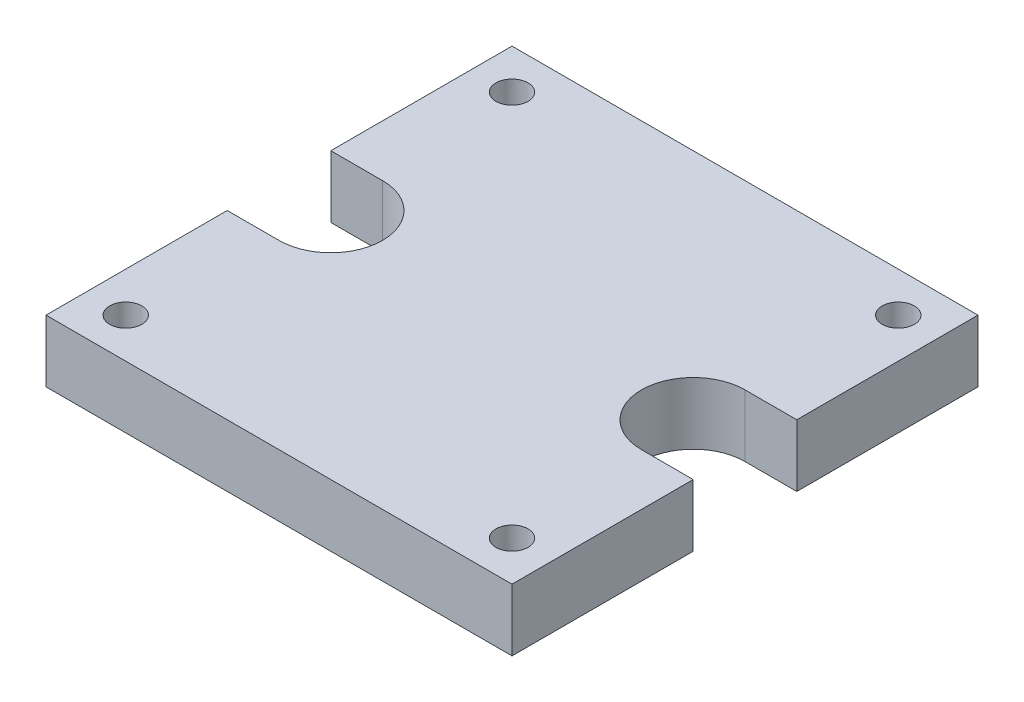
ISO-10303-21;
HEADER;
FILE_DESCRIPTION(('STEP AP214'),'2;1');
FILE_NAME('part.step','',(''),(''),'','','');
FILE_SCHEMA(('AUTOMOTIVE_DESIGN { 1 0 10303 214 1 1 1 1 }'));
ENDSEC;
DATA;
#1=APPLICATION_CONTEXT('core data for automotive mechanical design processes');
#2=APPLICATION_PROTOCOL_DEFINITION('international standard','automotive_design',2000,#1);
#3=PRODUCT_CONTEXT('',#1,'mechanical');
#4=PRODUCT('Part','Part','',(#3));
#5=PRODUCT_RELATED_PRODUCT_CATEGORY('part','',(#4));
#6=PRODUCT_DEFINITION_FORMATION('','',#4);
#7=PRODUCT_DEFINITION_CONTEXT('part definition',#1,'design');
#8=PRODUCT_DEFINITION('design','',#6,#7);
#9=PRODUCT_DEFINITION_SHAPE('','',#8);
#10=(LENGTH_UNIT() NAMED_UNIT(*) SI_UNIT(.MILLI.,.METRE.));
#11=(NAMED_UNIT(*) PLANE_ANGLE_UNIT() SI_UNIT($,.RADIAN.));
#12=(NAMED_UNIT(*) SI_UNIT($,.STERADIAN.) SOLID_ANGLE_UNIT());
#13=UNCERTAINTY_MEASURE_WITH_UNIT(LENGTH_MEASURE(1.E-05),#10,'distance_accuracy_value','');
#14=(GEOMETRIC_REPRESENTATION_CONTEXT(3) GLOBAL_UNCERTAINTY_ASSIGNED_CONTEXT((#13)) GLOBAL_UNIT_ASSIGNED_CONTEXT((#10,
#11,#12)) REPRESENTATION_CONTEXT('',''));
#15=CARTESIAN_POINT('',(0.,0.,0.));
#16=DIRECTION('',(0.,0.,1.));
#17=DIRECTION('',(1.,0.,0.));
#18=AXIS2_PLACEMENT_3D('',#15,#16,#17);
#19=CARTESIAN_POINT('',(-17.5,6.,0.));
#20=DIRECTION('',(0.,-1.,0.));
#21=DIRECTION('',(0.,0.,-1.));
#22=AXIS2_PLACEMENT_3D('',#19,#20,#21);
#23=CYLINDRICAL_SURFACE('',#22,5.);
#24=CARTESIAN_POINT('',(-17.5,0.,0.));
#25=DIRECTION('',(0.,1.,0.));
#26=DIRECTION('',(0.,0.,1.));
#27=AXIS2_PLACEMENT_3D('',#24,#25,#26);
#28=CIRCLE('',#27,5.);
#29=CARTESIAN_POINT('',(-17.5,0.,5.00000000000001));
#30=VERTEX_POINT('',#29);
#31=CARTESIAN_POINT('',(-17.5,0.,-4.99999999999999));
#32=VERTEX_POINT('',#31);
#33=EDGE_CURVE('E202',#30,#32,#28,.T.);
#34=ORIENTED_EDGE('',*,*,#33,.F.);
#35=DIRECTION('',(0.,-1.,0.));
#36=VECTOR('',#35,1.);
#37=CARTESIAN_POINT('',(-17.5,6.,5.00000000000001));
#38=LINE('',#37,#36);
#39=CARTESIAN_POINT('',(-17.5,6.,5.00000000000001));
#40=VERTEX_POINT('',#39);
#41=EDGE_CURVE('E11',#40,#30,#38,.T.);
#42=ORIENTED_EDGE('',*,*,#41,.F.);
#43=CARTESIAN_POINT('',(-17.5,6.,0.));
#44=DIRECTION('',(0.,1.,0.));
#45=DIRECTION('',(0.,0.,1.));
#46=AXIS2_PLACEMENT_3D('',#43,#44,#45);
#47=CIRCLE('',#46,5.);
#48=CARTESIAN_POINT('',(-17.5,6.,-4.99999999999999));
#49=VERTEX_POINT('',#48);
#50=EDGE_CURVE('E160',#40,#49,#47,.T.);
#51=ORIENTED_EDGE('',*,*,#50,.T.);
#52=DIRECTION('',(0.,-1.,0.));
#53=VECTOR('',#52,1.);
#54=CARTESIAN_POINT('',(-17.5,6.,-4.99999999999999));
#55=LINE('',#54,#53);
#56=EDGE_CURVE('E95',#49,#32,#55,.T.);
#57=ORIENTED_EDGE('',*,*,#56,.T.);
#58=EDGE_LOOP('',(#34,#42,#51,#57));
#59=FACE_BOUND('',#58,.T.);
#60=ADVANCED_FACE('F33',(#59),#23,.F.);
#61=CARTESIAN_POINT('',(0.,6.,5.00000000000001));
#62=DIRECTION('',(0.,0.,-1.));
#63=DIRECTION('',(-1.,0.,0.));
#64=AXIS2_PLACEMENT_3D('',#61,#62,#63);
#65=PLANE('',#64);
#66=DIRECTION('',(1.,0.,0.));
#67=VECTOR('',#66,1.);
#68=CARTESIAN_POINT('',(0.,0.,5.00000000000001));
#69=LINE('',#68,#67);
#70=CARTESIAN_POINT('',(-22.5,0.,5.00000000000001));
#71=VERTEX_POINT('',#70);
#72=EDGE_CURVE('E198',#71,#30,#69,.T.);
#73=ORIENTED_EDGE('',*,*,#72,.F.);
#74=DIRECTION('',(0.,-1.,0.));
#75=VECTOR('',#74,1.);
#76=CARTESIAN_POINT('',(-22.5,6.,5.00000000000001));
#77=LINE('',#76,#75);
#78=CARTESIAN_POINT('',(-22.5,6.,5.00000000000001));
#79=VERTEX_POINT('',#78);
#80=EDGE_CURVE('E41',#79,#71,#77,.T.);
#81=ORIENTED_EDGE('',*,*,#80,.F.);
#82=DIRECTION('',(1.,0.,0.));
#83=VECTOR('',#82,1.);
#84=CARTESIAN_POINT('',(0.,6.,5.00000000000001));
#85=LINE('',#84,#83);
#86=EDGE_CURVE('E155',#79,#40,#85,.T.);
#87=ORIENTED_EDGE('',*,*,#86,.T.);
#88=ORIENTED_EDGE('',*,*,#41,.T.);
#89=EDGE_LOOP('',(#73,#81,#87,#88));
#90=FACE_BOUND('',#89,.T.);
#91=ADVANCED_FACE('F199',(#90),#65,.T.);
#92=CARTESIAN_POINT('',(-22.5,6.,0.));
#93=DIRECTION('',(-1.,0.,0.));
#94=DIRECTION('',(0.,0.,1.));
#95=AXIS2_PLACEMENT_3D('',#92,#93,#94);
#96=PLANE('',#95);
#97=DIRECTION('',(0.,0.,-1.));
#98=VECTOR('',#97,1.);
#99=CARTESIAN_POINT('',(-22.5,0.,0.));
#100=LINE('',#99,#98);
#101=CARTESIAN_POINT('',(-22.5,0.,22.5));
#102=VERTEX_POINT('',#101);
#103=EDGE_CURVE('E196',#102,#71,#100,.T.);
#104=ORIENTED_EDGE('',*,*,#103,.F.);
#105=DIRECTION('',(0.,-1.,0.));
#106=VECTOR('',#105,1.);
#107=CARTESIAN_POINT('',(-22.5,6.,22.5));
#108=LINE('',#107,#106);
#109=CARTESIAN_POINT('',(-22.5,6.,22.5));
#110=VERTEX_POINT('',#109);
#111=EDGE_CURVE('E191',#110,#102,#108,.T.);
#112=ORIENTED_EDGE('',*,*,#111,.F.);
#113=DIRECTION('',(0.,0.,-1.));
#114=VECTOR('',#113,1.);
#115=CARTESIAN_POINT('',(-22.5,6.,0.));
#116=LINE('',#115,#114);
#117=EDGE_CURVE('E148',#110,#79,#116,.T.);
#118=ORIENTED_EDGE('',*,*,#117,.T.);
#119=ORIENTED_EDGE('',*,*,#80,.T.);
#120=EDGE_LOOP('',(#104,#112,#118,#119));
#121=FACE_BOUND('',#120,.T.);
#122=ADVANCED_FACE('F194',(#121),#96,.T.);
#123=CARTESIAN_POINT('',(0.,6.,22.5));
#124=DIRECTION('',(0.,0.,-1.));
#125=DIRECTION('',(-1.,0.,0.));
#126=AXIS2_PLACEMENT_3D('',#123,#124,#125);
#127=PLANE('',#126);
#128=DIRECTION('',(1.,0.,0.));
#129=VECTOR('',#128,1.);
#130=CARTESIAN_POINT('',(0.,0.,22.5));
#131=LINE('',#130,#129);
#132=CARTESIAN_POINT('',(22.5,0.,22.5));
#133=VERTEX_POINT('',#132);
#134=EDGE_CURVE('E208',#102,#133,#131,.T.);
#135=ORIENTED_EDGE('',*,*,#134,.T.);
#136=DIRECTION('',(0.,-1.,0.));
#137=VECTOR('',#136,1.);
#138=CARTESIAN_POINT('',(22.5,6.,22.5));
#139=LINE('',#138,#137);
#140=CARTESIAN_POINT('',(22.5,6.,22.5));
#141=VERTEX_POINT('',#140);
#142=EDGE_CURVE('E188',#141,#133,#139,.T.);
#143=ORIENTED_EDGE('',*,*,#142,.F.);
#144=DIRECTION('',(1.,0.,0.));
#145=VECTOR('',#144,1.);
#146=CARTESIAN_POINT('',(0.,6.,22.5));
#147=LINE('',#146,#145);
#148=EDGE_CURVE('E154',#110,#141,#147,.T.);
#149=ORIENTED_EDGE('',*,*,#148,.F.);
#150=ORIENTED_EDGE('',*,*,#111,.T.);
#151=EDGE_LOOP('',(#135,#143,#149,#150));
#152=FACE_BOUND('',#151,.T.);
#153=ADVANCED_FACE('F305',(#152),#127,.F.);
#154=CARTESIAN_POINT('',(22.5,6.,0.));
#155=DIRECTION('',(-1.,0.,0.));
#156=DIRECTION('',(0.,0.,1.));
#157=AXIS2_PLACEMENT_3D('',#154,#155,#156);
#158=PLANE('',#157);
#159=DIRECTION('',(0.,0.,-1.));
#160=VECTOR('',#159,1.);
#161=CARTESIAN_POINT('',(22.5,0.,0.));
#162=LINE('',#161,#160);
#163=CARTESIAN_POINT('',(22.5,0.,5.00000000000001));
#164=VERTEX_POINT('',#163);
#165=EDGE_CURVE('E211',#133,#164,#162,.T.);
#166=ORIENTED_EDGE('',*,*,#165,.T.);
#167=DIRECTION('',(0.,-1.,0.));
#168=VECTOR('',#167,1.);
#169=CARTESIAN_POINT('',(22.5,6.,5.00000000000001));
#170=LINE('',#169,#168);
#171=CARTESIAN_POINT('',(22.5,6.,5.00000000000001));
#172=VERTEX_POINT('',#171);
#173=EDGE_CURVE('E185',#172,#164,#170,.T.);
#174=ORIENTED_EDGE('',*,*,#173,.F.);
#175=DIRECTION('',(0.,0.,-1.));
#176=VECTOR('',#175,1.);
#177=CARTESIAN_POINT('',(22.5,6.,0.));
#178=LINE('',#177,#176);
#179=EDGE_CURVE('E158',#141,#172,#178,.T.);
#180=ORIENTED_EDGE('',*,*,#179,.F.);
#181=ORIENTED_EDGE('',*,*,#142,.T.);
#182=EDGE_LOOP('',(#166,#174,#180,#181));
#183=FACE_BOUND('',#182,.T.);
#184=ADVANCED_FACE('F278',(#183),#158,.F.);
#185=CARTESIAN_POINT('',(0.,6.,5.00000000000001));
#186=DIRECTION('',(0.,0.,1.));
#187=DIRECTION('',(1.,0.,0.));
#188=AXIS2_PLACEMENT_3D('',#185,#186,#187);
#189=PLANE('',#188);
#190=DIRECTION('',(-1.,0.,0.));
#191=VECTOR('',#190,1.);
#192=CARTESIAN_POINT('',(0.,0.,5.00000000000001));
#193=LINE('',#192,#191);
#194=CARTESIAN_POINT('',(17.5,0.,5.00000000000001));
#195=VERTEX_POINT('',#194);
#196=EDGE_CURVE('E283',#164,#195,#193,.T.);
#197=ORIENTED_EDGE('',*,*,#196,.T.);
#198=DIRECTION('',(0.,-1.,0.));
#199=VECTOR('',#198,1.);
#200=CARTESIAN_POINT('',(17.5,6.,5.00000000000001));
#201=LINE('',#200,#199);
#202=CARTESIAN_POINT('',(17.5,6.,5.00000000000001));
#203=VERTEX_POINT('',#202);
#204=EDGE_CURVE('E183',#203,#195,#201,.T.);
#205=ORIENTED_EDGE('',*,*,#204,.F.);
#206=DIRECTION('',(-1.,0.,0.));
#207=VECTOR('',#206,1.);
#208=CARTESIAN_POINT('',(0.,6.,5.00000000000001));
#209=LINE('',#208,#207);
#210=EDGE_CURVE('E268',#172,#203,#209,.T.);
#211=ORIENTED_EDGE('',*,*,#210,.F.);
#212=ORIENTED_EDGE('',*,*,#173,.T.);
#213=EDGE_LOOP('',(#197,#205,#211,#212));
#214=FACE_BOUND('',#213,.T.);
#215=ADVANCED_FACE('F282',(#214),#189,.F.);
#216=CARTESIAN_POINT('',(17.5,6.,0.));
#217=DIRECTION('',(0.,-1.,0.));
#218=DIRECTION('',(0.,0.,-1.));
#219=AXIS2_PLACEMENT_3D('',#216,#217,#218);
#220=CYLINDRICAL_SURFACE('',#219,5.00000000000001);
#221=CARTESIAN_POINT('',(17.5,0.,0.));
#222=DIRECTION('',(0.,1.,0.));
#223=DIRECTION('',(0.,0.,1.));
#224=AXIS2_PLACEMENT_3D('',#221,#222,#223);
#225=CIRCLE('',#224,5.00000000000001);
#226=CARTESIAN_POINT('',(17.5,0.,-5.));
#227=VERTEX_POINT('',#226);
#228=EDGE_CURVE('E294',#227,#195,#225,.T.);
#229=ORIENTED_EDGE('',*,*,#228,.F.);
#230=DIRECTION('',(0.,-1.,0.));
#231=VECTOR('',#230,1.);
#232=CARTESIAN_POINT('',(17.5,6.,-5.));
#233=LINE('',#232,#231);
#234=CARTESIAN_POINT('',(17.5,6.,-5.));
#235=VERTEX_POINT('',#234);
#236=EDGE_CURVE('E181',#235,#227,#233,.T.);
#237=ORIENTED_EDGE('',*,*,#236,.F.);
#238=CARTESIAN_POINT('',(17.5,6.,0.));
#239=DIRECTION('',(0.,1.,0.));
#240=DIRECTION('',(0.,0.,1.));
#241=AXIS2_PLACEMENT_3D('',#238,#239,#240);
#242=CIRCLE('',#241,5.00000000000001);
#243=EDGE_CURVE('E265',#235,#203,#242,.T.);
#244=ORIENTED_EDGE('',*,*,#243,.T.);
#245=ORIENTED_EDGE('',*,*,#204,.T.);
#246=EDGE_LOOP('',(#229,#237,#244,#245));
#247=FACE_BOUND('',#246,.T.);
#248=ADVANCED_FACE('F287',(#247),#220,.F.);
#249=CARTESIAN_POINT('',(0.,6.,-5.));
#250=DIRECTION('',(0.,0.,1.));
#251=DIRECTION('',(1.,0.,0.));
#252=AXIS2_PLACEMENT_3D('',#249,#250,#251);
#253=PLANE('',#252);
#254=DIRECTION('',(-1.,0.,0.));
#255=VECTOR('',#254,1.);
#256=CARTESIAN_POINT('',(0.,0.,-5.));
#257=LINE('',#256,#255);
#258=CARTESIAN_POINT('',(22.5,0.,-5.));
#259=VERTEX_POINT('',#258);
#260=EDGE_CURVE('E220',#259,#227,#257,.T.);
#261=ORIENTED_EDGE('',*,*,#260,.F.);
#262=DIRECTION('',(0.,-1.,0.));
#263=VECTOR('',#262,1.);
#264=CARTESIAN_POINT('',(22.5,6.,-5.));
#265=LINE('',#264,#263);
#266=CARTESIAN_POINT('',(22.5,6.,-5.));
#267=VERTEX_POINT('',#266);
#268=EDGE_CURVE('E179',#267,#259,#265,.T.);
#269=ORIENTED_EDGE('',*,*,#268,.F.);
#270=DIRECTION('',(-1.,0.,0.));
#271=VECTOR('',#270,1.);
#272=CARTESIAN_POINT('',(0.,6.,-5.));
#273=LINE('',#272,#271);
#274=EDGE_CURVE('E262',#267,#235,#273,.T.);
#275=ORIENTED_EDGE('',*,*,#274,.T.);
#276=ORIENTED_EDGE('',*,*,#236,.T.);
#277=EDGE_LOOP('',(#261,#269,#275,#276));
#278=FACE_BOUND('',#277,.T.);
#279=ADVANCED_FACE('F290',(#278),#253,.T.);
#280=CARTESIAN_POINT('',(22.5,0.,-22.5));
#281=VERTEX_POINT('',#280);
#282=EDGE_CURVE('E216',#259,#281,#162,.T.);
#283=ORIENTED_EDGE('',*,*,#282,.T.);
#284=DIRECTION('',(0.,-1.,0.));
#285=VECTOR('',#284,1.);
#286=CARTESIAN_POINT('',(22.5,6.,-22.5));
#287=LINE('',#286,#285);
#288=CARTESIAN_POINT('',(22.5,6.,-22.5));
#289=VERTEX_POINT('',#288);
#290=EDGE_CURVE('E136',#289,#281,#287,.T.);
#291=ORIENTED_EDGE('',*,*,#290,.F.);
#292=EDGE_CURVE('E143',#267,#289,#178,.T.);
#293=ORIENTED_EDGE('',*,*,#292,.F.);
#294=ORIENTED_EDGE('',*,*,#268,.T.);
#295=EDGE_LOOP('',(#283,#291,#293,#294));
#296=FACE_BOUND('',#295,.T.);
#297=ADVANCED_FACE('F293',(#296),#158,.F.);
#298=CARTESIAN_POINT('',(0.,6.,-22.5));
#299=DIRECTION('',(0.,0.,-1.));
#300=DIRECTION('',(-1.,0.,0.));
#301=AXIS2_PLACEMENT_3D('',#298,#299,#300);
#302=PLANE('',#301);
#303=DIRECTION('',(1.,0.,0.));
#304=VECTOR('',#303,1.);
#305=CARTESIAN_POINT('',(0.,0.,-22.5));
#306=LINE('',#305,#304);
#307=CARTESIAN_POINT('',(-22.5,0.,-22.5));
#308=VERTEX_POINT('',#307);
#309=EDGE_CURVE('E131',#308,#281,#306,.T.);
#310=ORIENTED_EDGE('',*,*,#309,.F.);
#311=DIRECTION('',(0.,-1.,0.));
#312=VECTOR('',#311,1.);
#313=CARTESIAN_POINT('',(-22.5,6.,-22.5));
#314=LINE('',#313,#312);
#315=CARTESIAN_POINT('',(-22.5,6.,-22.5));
#316=VERTEX_POINT('',#315);
#317=EDGE_CURVE('E126',#316,#308,#314,.T.);
#318=ORIENTED_EDGE('',*,*,#317,.F.);
#319=DIRECTION('',(1.,0.,0.));
#320=VECTOR('',#319,1.);
#321=CARTESIAN_POINT('',(0.,6.,-22.5));
#322=LINE('',#321,#320);
#323=EDGE_CURVE('E129',#316,#289,#322,.T.);
#324=ORIENTED_EDGE('',*,*,#323,.T.);
#325=ORIENTED_EDGE('',*,*,#290,.T.);
#326=EDGE_LOOP('',(#310,#318,#324,#325));
#327=FACE_BOUND('',#326,.T.);
#328=ADVANCED_FACE('F128',(#327),#302,.T.);
#329=CARTESIAN_POINT('',(-22.5,0.,-4.99999999999999));
#330=VERTEX_POINT('',#329);
#331=EDGE_CURVE('E210',#330,#308,#100,.T.);
#332=ORIENTED_EDGE('',*,*,#331,.F.);
#333=DIRECTION('',(0.,-1.,0.));
#334=VECTOR('',#333,1.);
#335=CARTESIAN_POINT('',(-22.5,6.,-4.99999999999999));
#336=LINE('',#335,#334);
#337=CARTESIAN_POINT('',(-22.5,6.,-4.99999999999999));
#338=VERTEX_POINT('',#337);
#339=EDGE_CURVE('E88',#338,#330,#336,.T.);
#340=ORIENTED_EDGE('',*,*,#339,.F.);
#341=EDGE_CURVE('E140',#338,#316,#116,.T.);
#342=ORIENTED_EDGE('',*,*,#341,.T.);
#343=ORIENTED_EDGE('',*,*,#317,.T.);
#344=EDGE_LOOP('',(#332,#340,#342,#343));
#345=FACE_BOUND('',#344,.T.);
#346=ADVANCED_FACE('F146',(#345),#96,.T.);
#347=CARTESIAN_POINT('',(18.65,6.,-18.65));
#348=DIRECTION('',(0.,-1.,0.));
#349=DIRECTION('',(0.,0.,-1.));
#350=AXIS2_PLACEMENT_3D('',#347,#348,#349);
#351=CYLINDRICAL_SURFACE('',#350,1.55);
#352=CARTESIAN_POINT('',(18.65,6.,-18.65));
#353=DIRECTION('',(0.,1.,0.));
#354=DIRECTION('',(0.,0.,1.));
#355=AXIS2_PLACEMENT_3D('',#352,#353,#354);
#356=CIRCLE('',#355,1.55);
#357=CARTESIAN_POINT('',(18.65,6.,-17.1));
#358=VERTEX_POINT('',#357);
#359=EDGE_CURVE('E255',#358,#358,#356,.T.);
#360=ORIENTED_EDGE('',*,*,#359,.T.);
#361=EDGE_LOOP('',(#360));
#362=FACE_BOUND('',#361,.T.);
#363=CARTESIAN_POINT('',(18.65,0.,-18.65));
#364=DIRECTION('',(0.,1.,0.));
#365=DIRECTION('',(0.,0.,1.));
#366=AXIS2_PLACEMENT_3D('',#363,#364,#365);
#367=CIRCLE('',#366,1.55);
#368=CARTESIAN_POINT('',(18.65,0.,-17.1));
#369=VERTEX_POINT('',#368);
#370=EDGE_CURVE('E166',#369,#369,#367,.T.);
#371=ORIENTED_EDGE('',*,*,#370,.F.);
#372=EDGE_LOOP('',(#371));
#373=FACE_BOUND('',#372,.T.);
#374=ADVANCED_FACE('F234',(#362,#373),#351,.F.);
#375=CARTESIAN_POINT('',(-18.65,6.,-18.65));
#376=DIRECTION('',(0.,-1.,0.));
#377=DIRECTION('',(0.,0.,-1.));
#378=AXIS2_PLACEMENT_3D('',#375,#376,#377);
#379=CYLINDRICAL_SURFACE('',#378,1.55);
#380=CARTESIAN_POINT('',(-18.65,6.,-18.65));
#381=DIRECTION('',(0.,1.,0.));
#382=DIRECTION('',(0.,0.,1.));
#383=AXIS2_PLACEMENT_3D('',#380,#381,#382);
#384=CIRCLE('',#383,1.55);
#385=CARTESIAN_POINT('',(-18.65,6.,-17.1));
#386=VERTEX_POINT('',#385);
#387=EDGE_CURVE('E258',#386,#386,#384,.T.);
#388=ORIENTED_EDGE('',*,*,#387,.T.);
#389=EDGE_LOOP('',(#388));
#390=FACE_BOUND('',#389,.T.);
#391=CARTESIAN_POINT('',(-18.65,0.,-18.65));
#392=DIRECTION('',(0.,1.,0.));
#393=DIRECTION('',(0.,0.,1.));
#394=AXIS2_PLACEMENT_3D('',#391,#392,#393);
#395=CIRCLE('',#394,1.55);
#396=CARTESIAN_POINT('',(-18.65,0.,-17.1));
#397=VERTEX_POINT('',#396);
#398=EDGE_CURVE('E171',#397,#397,#395,.T.);
#399=ORIENTED_EDGE('',*,*,#398,.F.);
#400=EDGE_LOOP('',(#399));
#401=FACE_BOUND('',#400,.T.);
#402=ADVANCED_FACE('F231',(#390,#401),#379,.F.);
#403=CARTESIAN_POINT('',(-18.65,6.,18.65));
#404=DIRECTION('',(0.,-1.,0.));
#405=DIRECTION('',(0.,0.,-1.));
#406=AXIS2_PLACEMENT_3D('',#403,#404,#405);
#407=CYLINDRICAL_SURFACE('',#406,1.55);
#408=CARTESIAN_POINT('',(-18.65,6.,18.65));
#409=DIRECTION('',(0.,1.,0.));
#410=DIRECTION('',(0.,0.,1.));
#411=AXIS2_PLACEMENT_3D('',#408,#409,#410);
#412=CIRCLE('',#411,1.55);
#413=CARTESIAN_POINT('',(-18.65,6.,20.2));
#414=VERTEX_POINT('',#413);
#415=EDGE_CURVE('E149',#414,#414,#412,.T.);
#416=ORIENTED_EDGE('',*,*,#415,.T.);
#417=EDGE_LOOP('',(#416));
#418=FACE_BOUND('',#417,.T.);
#419=CARTESIAN_POINT('',(-18.65,0.,18.65));
#420=DIRECTION('',(0.,1.,0.));
#421=DIRECTION('',(0.,0.,1.));
#422=AXIS2_PLACEMENT_3D('',#419,#420,#421);
#423=CIRCLE('',#422,1.55);
#424=CARTESIAN_POINT('',(-18.65,0.,20.2));
#425=VERTEX_POINT('',#424);
#426=EDGE_CURVE('E214',#425,#425,#423,.T.);
#427=ORIENTED_EDGE('',*,*,#426,.F.);
#428=EDGE_LOOP('',(#427));
#429=FACE_BOUND('',#428,.T.);
#430=ADVANCED_FACE('F233',(#418,#429),#407,.F.);
#431=CARTESIAN_POINT('',(0.,6.,-4.99999999999999));
#432=DIRECTION('',(0.,0.,-1.));
#433=DIRECTION('',(-1.,0.,0.));
#434=AXIS2_PLACEMENT_3D('',#431,#432,#433);
#435=PLANE('',#434);
#436=DIRECTION('',(1.,0.,0.));
#437=VECTOR('',#436,1.);
#438=CARTESIAN_POINT('',(0.,0.,-4.99999999999999));
#439=LINE('',#438,#437);
#440=EDGE_CURVE('E213',#330,#32,#439,.T.);
#441=ORIENTED_EDGE('',*,*,#440,.T.);
#442=ORIENTED_EDGE('',*,*,#56,.F.);
#443=DIRECTION('',(1.,0.,0.));
#444=VECTOR('',#443,1.);
#445=CARTESIAN_POINT('',(0.,6.,-4.99999999999999));
#446=LINE('',#445,#444);
#447=EDGE_CURVE('E49',#338,#49,#446,.T.);
#448=ORIENTED_EDGE('',*,*,#447,.F.);
#449=ORIENTED_EDGE('',*,*,#339,.T.);
#450=EDGE_LOOP('',(#441,#442,#448,#449));
#451=FACE_BOUND('',#450,.T.);
#452=ADVANCED_FACE('F241',(#451),#435,.F.);
#453=CARTESIAN_POINT('',(18.65,6.,18.65));
#454=DIRECTION('',(0.,-1.,0.));
#455=DIRECTION('',(0.,0.,-1.));
#456=AXIS2_PLACEMENT_3D('',#453,#454,#455);
#457=CYLINDRICAL_SURFACE('',#456,1.55);
#458=CARTESIAN_POINT('',(18.65,6.,18.65));
#459=DIRECTION('',(0.,1.,0.));
#460=DIRECTION('',(0.,0.,1.));
#461=AXIS2_PLACEMENT_3D('',#458,#459,#460);
#462=CIRCLE('',#461,1.55);
#463=CARTESIAN_POINT('',(18.65,6.,20.2));
#464=VERTEX_POINT('',#463);
#465=EDGE_CURVE('E176',#464,#464,#462,.T.);
#466=ORIENTED_EDGE('',*,*,#465,.T.);
#467=EDGE_LOOP('',(#466));
#468=FACE_BOUND('',#467,.T.);
#469=CARTESIAN_POINT('',(18.65,0.,18.65));
#470=DIRECTION('',(0.,1.,0.));
#471=DIRECTION('',(0.,0.,1.));
#472=AXIS2_PLACEMENT_3D('',#469,#470,#471);
#473=CIRCLE('',#472,1.55);
#474=CARTESIAN_POINT('',(18.65,0.,20.2));
#475=VERTEX_POINT('',#474);
#476=EDGE_CURVE('E163',#475,#475,#473,.T.);
#477=ORIENTED_EDGE('',*,*,#476,.F.);
#478=EDGE_LOOP('',(#477));
#479=FACE_BOUND('',#478,.T.);
#480=ADVANCED_FACE('F369',(#468,#479),#457,.F.);
#481=CARTESIAN_POINT('',(0.,6.,0.));
#482=DIRECTION('',(0.,1.,0.));
#483=DIRECTION('',(0.,0.,1.));
#484=AXIS2_PLACEMENT_3D('',#481,#482,#483);
#485=PLANE('',#484);
#486=ORIENTED_EDGE('',*,*,#50,.F.);
#487=ORIENTED_EDGE('',*,*,#86,.F.);
#488=ORIENTED_EDGE('',*,*,#117,.F.);
#489=ORIENTED_EDGE('',*,*,#148,.T.);
#490=ORIENTED_EDGE('',*,*,#179,.T.);
#491=ORIENTED_EDGE('',*,*,#210,.T.);
#492=ORIENTED_EDGE('',*,*,#243,.F.);
#493=ORIENTED_EDGE('',*,*,#274,.F.);
#494=ORIENTED_EDGE('',*,*,#292,.T.);
#495=ORIENTED_EDGE('',*,*,#323,.F.);
#496=ORIENTED_EDGE('',*,*,#341,.F.);
#497=ORIENTED_EDGE('',*,*,#447,.T.);
#498=EDGE_LOOP('',(#486,#487,#488,#489,#490,#491,#492,#493,#494,#495,#496,#497));
#499=FACE_BOUND('',#498,.T.);
#500=ORIENTED_EDGE('',*,*,#415,.F.);
#501=EDGE_LOOP('',(#500));
#502=FACE_BOUND('',#501,.T.);
#503=ORIENTED_EDGE('',*,*,#387,.F.);
#504=EDGE_LOOP('',(#503));
#505=FACE_BOUND('',#504,.T.);
#506=ORIENTED_EDGE('',*,*,#359,.F.);
#507=EDGE_LOOP('',(#506));
#508=FACE_BOUND('',#507,.T.);
#509=ORIENTED_EDGE('',*,*,#465,.F.);
#510=EDGE_LOOP('',(#509));
#511=FACE_BOUND('',#510,.T.);
#512=ADVANCED_FACE('F138',(#499,#502,#505,#508,#511),#485,.T.);
#513=CARTESIAN_POINT('',(0.,0.,0.));
#514=DIRECTION('',(0.,1.,0.));
#515=DIRECTION('',(0.,0.,1.));
#516=AXIS2_PLACEMENT_3D('',#513,#514,#515);
#517=PLANE('',#516);
#518=ORIENTED_EDGE('',*,*,#33,.T.);
#519=ORIENTED_EDGE('',*,*,#440,.F.);
#520=ORIENTED_EDGE('',*,*,#331,.T.);
#521=ORIENTED_EDGE('',*,*,#309,.T.);
#522=ORIENTED_EDGE('',*,*,#282,.F.);
#523=ORIENTED_EDGE('',*,*,#260,.T.);
#524=ORIENTED_EDGE('',*,*,#228,.T.);
#525=ORIENTED_EDGE('',*,*,#196,.F.);
#526=ORIENTED_EDGE('',*,*,#165,.F.);
#527=ORIENTED_EDGE('',*,*,#134,.F.);
#528=ORIENTED_EDGE('',*,*,#103,.T.);
#529=ORIENTED_EDGE('',*,*,#72,.T.);
#530=EDGE_LOOP('',(#518,#519,#520,#521,#522,#523,#524,#525,#526,#527,#528,#529));
#531=FACE_BOUND('',#530,.T.);
#532=ORIENTED_EDGE('',*,*,#426,.T.);
#533=EDGE_LOOP('',(#532));
#534=FACE_BOUND('',#533,.T.);
#535=ORIENTED_EDGE('',*,*,#398,.T.);
#536=EDGE_LOOP('',(#535));
#537=FACE_BOUND('',#536,.T.);
#538=ORIENTED_EDGE('',*,*,#370,.T.);
#539=EDGE_LOOP('',(#538));
#540=FACE_BOUND('',#539,.T.);
#541=ORIENTED_EDGE('',*,*,#476,.T.);
#542=EDGE_LOOP('',(#541));
#543=FACE_BOUND('',#542,.T.);
#544=ADVANCED_FACE('F205',(#531,#534,#537,#540,#543),#517,.F.);
#545=CLOSED_SHELL('',(#60,#91,#122,#153,#184,#215,#248,#279,#297,#328,#346,#374,#402,#430,#452,
#480,#512,#544));
#546=MANIFOLD_SOLID_BREP('B2',#545);
#547=ADVANCED_BREP_SHAPE_REPRESENTATION('',(#18,#546),#14);
#548=SHAPE_DEFINITION_REPRESENTATION(#9,#547);
ENDSEC;
END-ISO-10303-21;
